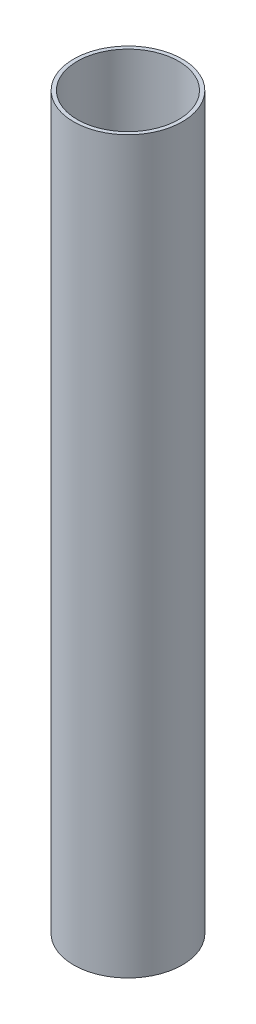
ISO-10303-21;
HEADER;
FILE_DESCRIPTION(('STEP AP214'),'2;1');
FILE_NAME('part.step','',(''),(''),'','','');
FILE_SCHEMA(('AUTOMOTIVE_DESIGN { 1 0 10303 214 1 1 1 1 }'));
ENDSEC;
DATA;
#1=APPLICATION_CONTEXT('core data for automotive mechanical design processes');
#2=APPLICATION_PROTOCOL_DEFINITION('international standard','automotive_design',2000,#1);
#3=PRODUCT_CONTEXT('',#1,'mechanical');
#4=PRODUCT('Part','Part','',(#3));
#5=PRODUCT_RELATED_PRODUCT_CATEGORY('part','',(#4));
#6=PRODUCT_DEFINITION_FORMATION('','',#4);
#7=PRODUCT_DEFINITION_CONTEXT('part definition',#1,'design');
#8=PRODUCT_DEFINITION('design','',#6,#7);
#9=PRODUCT_DEFINITION_SHAPE('','',#8);
#10=(LENGTH_UNIT() NAMED_UNIT(*) SI_UNIT(.MILLI.,.METRE.));
#11=(NAMED_UNIT(*) PLANE_ANGLE_UNIT() SI_UNIT($,.RADIAN.));
#12=(NAMED_UNIT(*) SI_UNIT($,.STERADIAN.) SOLID_ANGLE_UNIT());
#13=UNCERTAINTY_MEASURE_WITH_UNIT(LENGTH_MEASURE(1.E-05),#10,'distance_accuracy_value','');
#14=(GEOMETRIC_REPRESENTATION_CONTEXT(3) GLOBAL_UNCERTAINTY_ASSIGNED_CONTEXT((#13)) GLOBAL_UNIT_ASSIGNED_CONTEXT((#10,
#11,#12)) REPRESENTATION_CONTEXT('',''));
#15=CARTESIAN_POINT('',(0.,0.,0.));
#16=DIRECTION('',(0.,0.,1.));
#17=DIRECTION('',(1.,0.,0.));
#18=AXIS2_PLACEMENT_3D('',#15,#16,#17);
#19=CARTESIAN_POINT('',(0.,279.4,0.));
#20=DIRECTION('',(0.,1.,0.));
#21=DIRECTION('',(0.,0.,1.));
#22=AXIS2_PLACEMENT_3D('',#19,#20,#21);
#23=PLANE('',#22);
#24=CARTESIAN_POINT('',(0.,279.4,0.));
#25=DIRECTION('',(0.,1.,0.));
#26=DIRECTION('',(0.,0.,1.));
#27=AXIS2_PLACEMENT_3D('',#24,#25,#26);
#28=CIRCLE('',#27,20.8);
#29=CARTESIAN_POINT('',(0.,279.4,20.8));
#30=VERTEX_POINT('',#29);
#31=EDGE_CURVE('E10',#30,#30,#28,.T.);
#32=ORIENTED_EDGE('',*,*,#31,.T.);
#33=EDGE_LOOP('',(#32));
#34=FACE_BOUND('',#33,.T.);
#35=CARTESIAN_POINT('',(0.,279.4,0.));
#36=DIRECTION('',(0.,1.,0.));
#37=DIRECTION('',(0.,0.,1.));
#38=AXIS2_PLACEMENT_3D('',#35,#36,#37);
#39=CIRCLE('',#38,19.3675);
#40=CARTESIAN_POINT('',(0.,279.4,19.3675));
#41=VERTEX_POINT('',#40);
#42=EDGE_CURVE('E50',#41,#41,#39,.T.);
#43=ORIENTED_EDGE('',*,*,#42,.F.);
#44=EDGE_LOOP('',(#43));
#45=FACE_BOUND('',#44,.T.);
#46=ADVANCED_FACE('F37',(#34,#45),#23,.T.);
#47=CARTESIAN_POINT('',(0.,0.,0.));
#48=DIRECTION('',(0.,1.,0.));
#49=DIRECTION('',(0.,0.,1.));
#50=AXIS2_PLACEMENT_3D('',#47,#48,#49);
#51=PLANE('',#50);
#52=CARTESIAN_POINT('',(0.,0.,0.));
#53=DIRECTION('',(0.,1.,0.));
#54=DIRECTION('',(0.,0.,1.));
#55=AXIS2_PLACEMENT_3D('',#52,#53,#54);
#56=CIRCLE('',#55,20.8);
#57=CARTESIAN_POINT('',(0.,0.,20.8));
#58=VERTEX_POINT('',#57);
#59=EDGE_CURVE('E41',#58,#58,#56,.T.);
#60=ORIENTED_EDGE('',*,*,#59,.F.);
#61=EDGE_LOOP('',(#60));
#62=FACE_BOUND('',#61,.T.);
#63=CARTESIAN_POINT('',(0.,0.,0.));
#64=DIRECTION('',(0.,1.,0.));
#65=DIRECTION('',(0.,0.,1.));
#66=AXIS2_PLACEMENT_3D('',#63,#64,#65);
#67=CIRCLE('',#66,19.3675);
#68=CARTESIAN_POINT('',(0.,0.,19.3675));
#69=VERTEX_POINT('',#68);
#70=EDGE_CURVE('E52',#69,#69,#67,.T.);
#71=ORIENTED_EDGE('',*,*,#70,.T.);
#72=EDGE_LOOP('',(#71));
#73=FACE_BOUND('',#72,.T.);
#74=ADVANCED_FACE('F64',(#62,#73),#51,.F.);
#75=CARTESIAN_POINT('',(0.,279.4,0.));
#76=DIRECTION('',(0.,-1.,0.));
#77=DIRECTION('',(0.,0.,-1.));
#78=AXIS2_PLACEMENT_3D('',#75,#76,#77);
#79=CYLINDRICAL_SURFACE('',#78,20.8);
#80=ORIENTED_EDGE('',*,*,#31,.F.);
#81=EDGE_LOOP('',(#80));
#82=FACE_BOUND('',#81,.T.);
#83=ORIENTED_EDGE('',*,*,#59,.T.);
#84=EDGE_LOOP('',(#83));
#85=FACE_BOUND('',#84,.T.);
#86=ADVANCED_FACE('F39',(#82,#85),#79,.T.);
#87=CARTESIAN_POINT('',(0.,279.4,0.));
#88=DIRECTION('',(0.,-1.,0.));
#89=DIRECTION('',(0.,0.,-1.));
#90=AXIS2_PLACEMENT_3D('',#87,#88,#89);
#91=CYLINDRICAL_SURFACE('',#90,19.3675);
#92=ORIENTED_EDGE('',*,*,#42,.T.);
#93=EDGE_LOOP('',(#92));
#94=FACE_BOUND('',#93,.T.);
#95=ORIENTED_EDGE('',*,*,#70,.F.);
#96=EDGE_LOOP('',(#95));
#97=FACE_BOUND('',#96,.T.);
#98=ADVANCED_FACE('F60',(#94,#97),#91,.F.);
#99=CLOSED_SHELL('',(#46,#74,#86,#98));
#100=MANIFOLD_SOLID_BREP('B2',#99);
#101=ADVANCED_BREP_SHAPE_REPRESENTATION('',(#18,#100),#14);
#102=SHAPE_DEFINITION_REPRESENTATION(#9,#101);
ENDSEC;
END-ISO-10303-21;
